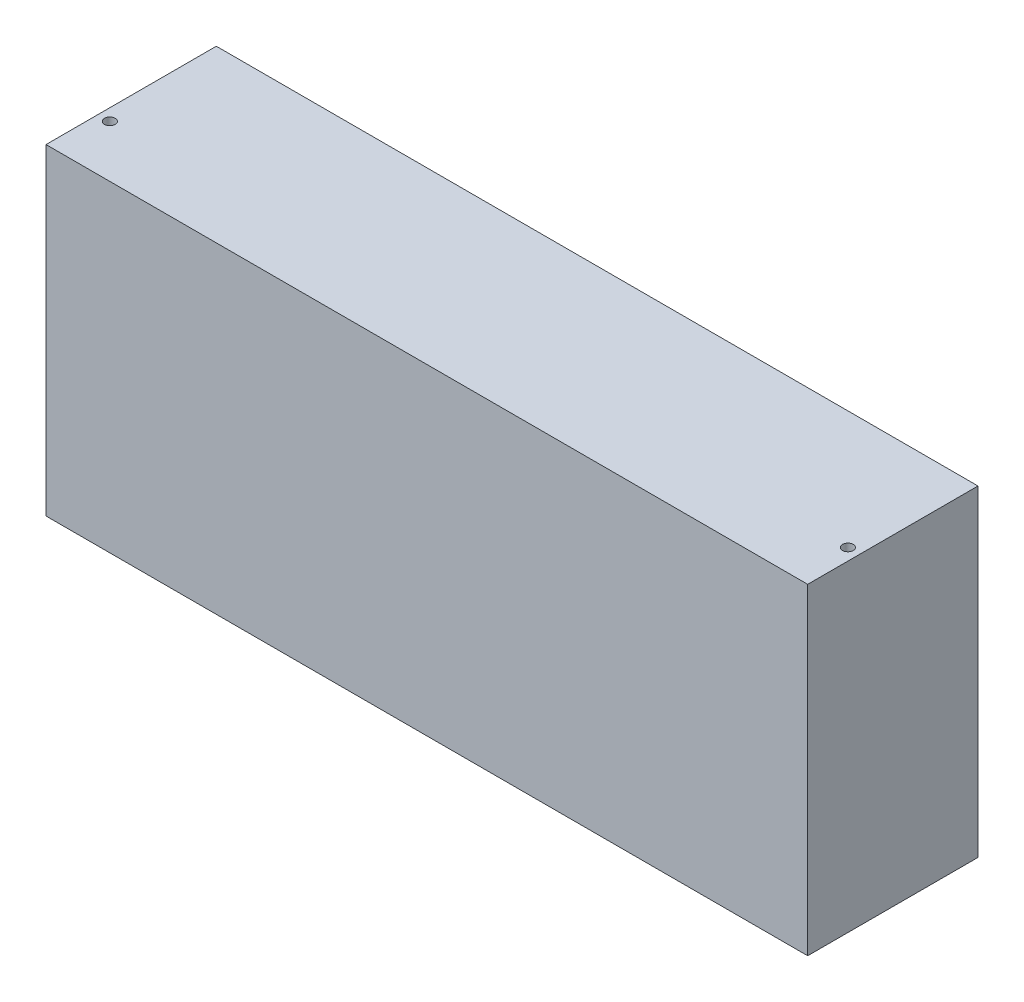
ISO-10303-21;
HEADER;
FILE_DESCRIPTION(('STEP AP214'),'2;1');
FILE_NAME('part.step','',(''),(''),'','','');
FILE_SCHEMA(('AUTOMOTIVE_DESIGN { 1 0 10303 214 1 1 1 1 }'));
ENDSEC;
DATA;
#1=APPLICATION_CONTEXT('core data for automotive mechanical design processes');
#2=APPLICATION_PROTOCOL_DEFINITION('international standard','automotive_design',2000,#1);
#3=PRODUCT_CONTEXT('',#1,'mechanical');
#4=PRODUCT('Part','Part','',(#3));
#5=PRODUCT_RELATED_PRODUCT_CATEGORY('part','',(#4));
#6=PRODUCT_DEFINITION_FORMATION('','',#4);
#7=PRODUCT_DEFINITION_CONTEXT('part definition',#1,'design');
#8=PRODUCT_DEFINITION('design','',#6,#7);
#9=PRODUCT_DEFINITION_SHAPE('','',#8);
#10=(LENGTH_UNIT() NAMED_UNIT(*) SI_UNIT(.MILLI.,.METRE.));
#11=(NAMED_UNIT(*) PLANE_ANGLE_UNIT() SI_UNIT($,.RADIAN.));
#12=(NAMED_UNIT(*) SI_UNIT($,.STERADIAN.) SOLID_ANGLE_UNIT());
#13=UNCERTAINTY_MEASURE_WITH_UNIT(LENGTH_MEASURE(1.E-05),#10,'distance_accuracy_value','');
#14=(GEOMETRIC_REPRESENTATION_CONTEXT(3) GLOBAL_UNCERTAINTY_ASSIGNED_CONTEXT((#13)) GLOBAL_UNIT_ASSIGNED_CONTEXT((#10,
#11,#12)) REPRESENTATION_CONTEXT('',''));
#15=CARTESIAN_POINT('',(0.,0.,0.));
#16=DIRECTION('',(0.,0.,1.));
#17=DIRECTION('',(1.,0.,0.));
#18=AXIS2_PLACEMENT_3D('',#15,#16,#17);
#19=CARTESIAN_POINT('',(0.,68.,0.));
#20=DIRECTION('',(0.,1.,0.));
#21=DIRECTION('',(0.,0.,1.));
#22=AXIS2_PLACEMENT_3D('',#19,#20,#21);
#23=PLANE('',#22);
#24=CARTESIAN_POINT('',(78.,68.,7.));
#25=DIRECTION('',(0.,1.,0.));
#26=DIRECTION('',(0.,0.,1.));
#27=AXIS2_PLACEMENT_3D('',#24,#25,#26);
#28=CIRCLE('',#27,1.1303);
#29=CARTESIAN_POINT('',(78.,68.,8.13030000000001));
#30=VERTEX_POINT('',#29);
#31=EDGE_CURVE('E100',#30,#30,#28,.T.);
#32=ORIENTED_EDGE('',*,*,#31,.F.);
#33=EDGE_LOOP('',(#32));
#34=FACE_BOUND('',#33,.T.);
#35=DIRECTION('',(0.,0.,-1.));
#36=VECTOR('',#35,1.);
#37=CARTESIAN_POINT('',(80.5,68.,-18.));
#38=LINE('',#37,#36);
#39=CARTESIAN_POINT('',(80.5,68.,18.));
#40=VERTEX_POINT('',#39);
#41=CARTESIAN_POINT('',(80.5,68.,-18.));
#42=VERTEX_POINT('',#41);
#43=EDGE_CURVE('E85',#40,#42,#38,.T.);
#44=ORIENTED_EDGE('',*,*,#43,.T.);
#45=DIRECTION('',(-1.,0.,0.));
#46=VECTOR('',#45,1.);
#47=CARTESIAN_POINT('',(-80.5,68.,-18.));
#48=LINE('',#47,#46);
#49=CARTESIAN_POINT('',(-80.5,68.,-18.));
#50=VERTEX_POINT('',#49);
#51=EDGE_CURVE('E80',#42,#50,#48,.T.);
#52=ORIENTED_EDGE('',*,*,#51,.T.);
#53=DIRECTION('',(0.,0.,1.));
#54=VECTOR('',#53,1.);
#55=CARTESIAN_POINT('',(-80.5,68.,-18.));
#56=LINE('',#55,#54);
#57=CARTESIAN_POINT('',(-80.5,68.,18.));
#58=VERTEX_POINT('',#57);
#59=EDGE_CURVE('E83',#50,#58,#56,.T.);
#60=ORIENTED_EDGE('',*,*,#59,.T.);
#61=DIRECTION('',(1.,0.,0.));
#62=VECTOR('',#61,1.);
#63=CARTESIAN_POINT('',(-80.5,68.,18.));
#64=LINE('',#63,#62);
#65=EDGE_CURVE('E50',#58,#40,#64,.T.);
#66=ORIENTED_EDGE('',*,*,#65,.T.);
#67=EDGE_LOOP('',(#44,#52,#60,#66));
#68=FACE_BOUND('',#67,.T.);
#69=CARTESIAN_POINT('',(-77.9999999999999,68.,7.00000000000012));
#70=DIRECTION('',(0.,1.,0.));
#71=DIRECTION('',(0.,0.,-1.));
#72=AXIS2_PLACEMENT_3D('',#69,#70,#71);
#73=CIRCLE('',#72,1.1303);
#74=CARTESIAN_POINT('',(-77.9999999999999,68.,5.86970000000012));
#75=VERTEX_POINT('',#74);
#76=EDGE_CURVE('E115',#75,#75,#73,.T.);
#77=ORIENTED_EDGE('',*,*,#76,.F.);
#78=EDGE_LOOP('',(#77));
#79=FACE_BOUND('',#78,.T.);
#80=ADVANCED_FACE('F33',(#34,#68,#79),#23,.T.);
#81=CARTESIAN_POINT('',(0.,0.,0.));
#82=DIRECTION('',(0.,1.,0.));
#83=DIRECTION('',(0.,0.,1.));
#84=AXIS2_PLACEMENT_3D('',#81,#82,#83);
#85=PLANE('',#84);
#86=CARTESIAN_POINT('',(78.,0.,7.));
#87=DIRECTION('',(0.,1.,0.));
#88=DIRECTION('',(0.,0.,1.));
#89=AXIS2_PLACEMENT_3D('',#86,#87,#88);
#90=CIRCLE('',#89,1.1303);
#91=CARTESIAN_POINT('',(78.,0.,8.13030000000001));
#92=VERTEX_POINT('',#91);
#93=EDGE_CURVE('E112',#92,#92,#90,.T.);
#94=ORIENTED_EDGE('',*,*,#93,.T.);
#95=EDGE_LOOP('',(#94));
#96=FACE_BOUND('',#95,.T.);
#97=DIRECTION('',(0.,0.,-1.));
#98=VECTOR('',#97,1.);
#99=CARTESIAN_POINT('',(80.5,0.,-18.));
#100=LINE('',#99,#98);
#101=CARTESIAN_POINT('',(80.5,0.,18.));
#102=VERTEX_POINT('',#101);
#103=CARTESIAN_POINT('',(80.5,0.,-18.));
#104=VERTEX_POINT('',#103);
#105=EDGE_CURVE('E97',#102,#104,#100,.T.);
#106=ORIENTED_EDGE('',*,*,#105,.F.);
#107=DIRECTION('',(1.,0.,0.));
#108=VECTOR('',#107,1.);
#109=CARTESIAN_POINT('',(-80.5,0.,18.));
#110=LINE('',#109,#108);
#111=CARTESIAN_POINT('',(-80.5,0.,18.));
#112=VERTEX_POINT('',#111);
#113=EDGE_CURVE('E73',#112,#102,#110,.T.);
#114=ORIENTED_EDGE('',*,*,#113,.F.);
#115=DIRECTION('',(0.,0.,1.));
#116=VECTOR('',#115,1.);
#117=CARTESIAN_POINT('',(-80.5,0.,-18.));
#118=LINE('',#117,#116);
#119=CARTESIAN_POINT('',(-80.5,0.,-18.));
#120=VERTEX_POINT('',#119);
#121=EDGE_CURVE('E67',#120,#112,#118,.T.);
#122=ORIENTED_EDGE('',*,*,#121,.F.);
#123=DIRECTION('',(-1.,0.,0.));
#124=VECTOR('',#123,1.);
#125=CARTESIAN_POINT('',(-80.5,0.,-18.));
#126=LINE('',#125,#124);
#127=EDGE_CURVE('E89',#104,#120,#126,.T.);
#128=ORIENTED_EDGE('',*,*,#127,.F.);
#129=EDGE_LOOP('',(#106,#114,#122,#128));
#130=FACE_BOUND('',#129,.T.);
#131=CARTESIAN_POINT('',(-77.9999999999999,0.,7.00000000000012));
#132=DIRECTION('',(0.,1.,0.));
#133=DIRECTION('',(0.,0.,-1.));
#134=AXIS2_PLACEMENT_3D('',#131,#132,#133);
#135=CIRCLE('',#134,1.1303);
#136=CARTESIAN_POINT('',(-77.9999999999999,0.,5.86970000000012));
#137=VERTEX_POINT('',#136);
#138=EDGE_CURVE('E118',#137,#137,#135,.T.);
#139=ORIENTED_EDGE('',*,*,#138,.T.);
#140=EDGE_LOOP('',(#139));
#141=FACE_BOUND('',#140,.T.);
#142=ADVANCED_FACE('F108',(#96,#130,#141),#85,.F.);
#143=CARTESIAN_POINT('',(80.5,68.,-18.));
#144=DIRECTION('',(-1.,0.,0.));
#145=DIRECTION('',(0.,0.,1.));
#146=AXIS2_PLACEMENT_3D('',#143,#144,#145);
#147=PLANE('',#146);
#148=ORIENTED_EDGE('',*,*,#105,.T.);
#149=DIRECTION('',(0.,-1.,0.));
#150=VECTOR('',#149,1.);
#151=CARTESIAN_POINT('',(80.5,68.,-18.));
#152=LINE('',#151,#150);
#153=EDGE_CURVE('E11',#42,#104,#152,.T.);
#154=ORIENTED_EDGE('',*,*,#153,.F.);
#155=ORIENTED_EDGE('',*,*,#43,.F.);
#156=DIRECTION('',(0.,-1.,0.));
#157=VECTOR('',#156,1.);
#158=CARTESIAN_POINT('',(80.5,68.,18.));
#159=LINE('',#158,#157);
#160=EDGE_CURVE('E93',#40,#102,#159,.T.);
#161=ORIENTED_EDGE('',*,*,#160,.T.);
#162=EDGE_LOOP('',(#148,#154,#155,#161));
#163=FACE_BOUND('',#162,.T.);
#164=ADVANCED_FACE('F35',(#163),#147,.F.);
#165=CARTESIAN_POINT('',(-80.5,68.,-18.));
#166=DIRECTION('',(0.,0.,1.));
#167=DIRECTION('',(1.,0.,0.));
#168=AXIS2_PLACEMENT_3D('',#165,#166,#167);
#169=PLANE('',#168);
#170=ORIENTED_EDGE('',*,*,#127,.T.);
#171=DIRECTION('',(0.,-1.,0.));
#172=VECTOR('',#171,1.);
#173=CARTESIAN_POINT('',(-80.5,68.,-18.));
#174=LINE('',#173,#172);
#175=EDGE_CURVE('E42',#50,#120,#174,.T.);
#176=ORIENTED_EDGE('',*,*,#175,.F.);
#177=ORIENTED_EDGE('',*,*,#51,.F.);
#178=ORIENTED_EDGE('',*,*,#153,.T.);
#179=EDGE_LOOP('',(#170,#176,#177,#178));
#180=FACE_BOUND('',#179,.T.);
#181=ADVANCED_FACE('F88',(#180),#169,.F.);
#182=CARTESIAN_POINT('',(-80.5,68.,-18.));
#183=DIRECTION('',(1.,0.,0.));
#184=DIRECTION('',(0.,0.,-1.));
#185=AXIS2_PLACEMENT_3D('',#182,#183,#184);
#186=PLANE('',#185);
#187=ORIENTED_EDGE('',*,*,#121,.T.);
#188=DIRECTION('',(0.,-1.,0.));
#189=VECTOR('',#188,1.);
#190=CARTESIAN_POINT('',(-80.5,68.,18.));
#191=LINE('',#190,#189);
#192=EDGE_CURVE('E90',#58,#112,#191,.T.);
#193=ORIENTED_EDGE('',*,*,#192,.F.);
#194=ORIENTED_EDGE('',*,*,#59,.F.);
#195=ORIENTED_EDGE('',*,*,#175,.T.);
#196=EDGE_LOOP('',(#187,#193,#194,#195));
#197=FACE_BOUND('',#196,.T.);
#198=ADVANCED_FACE('F91',(#197),#186,.F.);
#199=CARTESIAN_POINT('',(-80.5,68.,18.));
#200=DIRECTION('',(0.,0.,-1.));
#201=DIRECTION('',(-1.,0.,0.));
#202=AXIS2_PLACEMENT_3D('',#199,#200,#201);
#203=PLANE('',#202);
#204=ORIENTED_EDGE('',*,*,#113,.T.);
#205=ORIENTED_EDGE('',*,*,#160,.F.);
#206=ORIENTED_EDGE('',*,*,#65,.F.);
#207=ORIENTED_EDGE('',*,*,#192,.T.);
#208=EDGE_LOOP('',(#204,#205,#206,#207));
#209=FACE_BOUND('',#208,.T.);
#210=ADVANCED_FACE('F105',(#209),#203,.F.);
#211=CARTESIAN_POINT('',(78.,68.,7.));
#212=DIRECTION('',(0.,-1.,0.));
#213=DIRECTION('',(0.,0.,-1.));
#214=AXIS2_PLACEMENT_3D('',#211,#212,#213);
#215=CYLINDRICAL_SURFACE('',#214,1.1303);
#216=ORIENTED_EDGE('',*,*,#31,.T.);
#217=EDGE_LOOP('',(#216));
#218=FACE_BOUND('',#217,.T.);
#219=ORIENTED_EDGE('',*,*,#93,.F.);
#220=EDGE_LOOP('',(#219));
#221=FACE_BOUND('',#220,.T.);
#222=ADVANCED_FACE('F136',(#218,#221),#215,.F.);
#223=CARTESIAN_POINT('',(-77.9999999999999,68.,7.00000000000012));
#224=DIRECTION('',(0.,-1.,0.));
#225=DIRECTION('',(0.,0.,-1.));
#226=AXIS2_PLACEMENT_3D('',#223,#224,#225);
#227=CYLINDRICAL_SURFACE('',#226,1.1303);
#228=ORIENTED_EDGE('',*,*,#76,.T.);
#229=EDGE_LOOP('',(#228));
#230=FACE_BOUND('',#229,.T.);
#231=ORIENTED_EDGE('',*,*,#138,.F.);
#232=EDGE_LOOP('',(#231));
#233=FACE_BOUND('',#232,.T.);
#234=ADVANCED_FACE('F124',(#230,#233),#227,.F.);
#235=CLOSED_SHELL('',(#80,#142,#164,#181,#198,#210,#222,#234));
#236=MANIFOLD_SOLID_BREP('B2',#235);
#237=ADVANCED_BREP_SHAPE_REPRESENTATION('',(#18,#236),#14);
#238=SHAPE_DEFINITION_REPRESENTATION(#9,#237);
ENDSEC;
END-ISO-10303-21;
